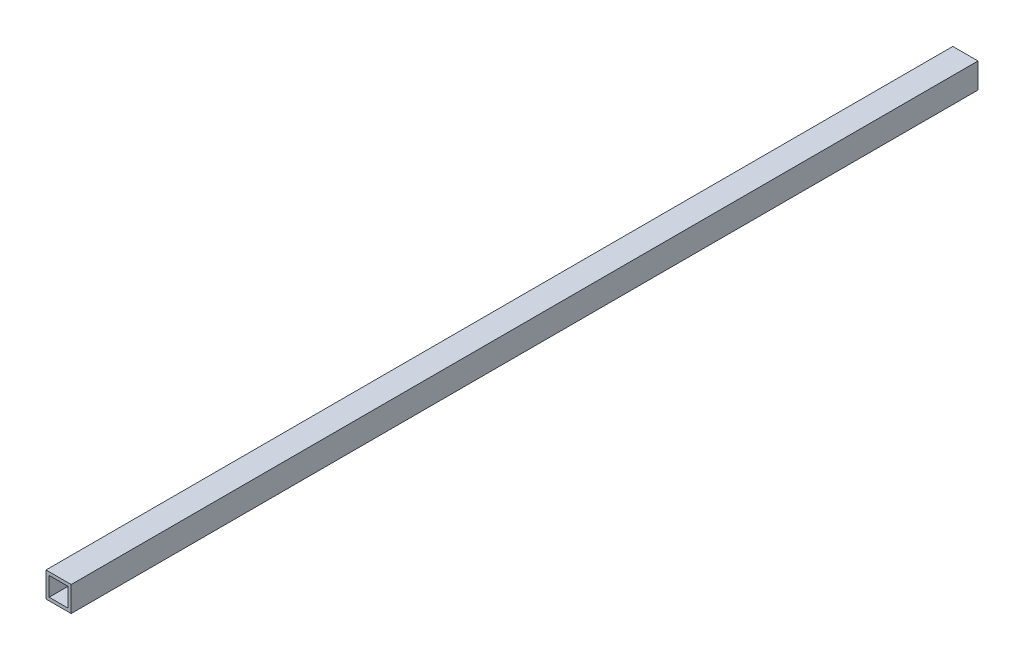
ISO-10303-21;
HEADER;
FILE_DESCRIPTION(('STEP AP214'),'2;1');
FILE_NAME('part.step','',(''),(''),'','','');
FILE_SCHEMA(('AUTOMOTIVE_DESIGN { 1 0 10303 214 1 1 1 1 }'));
ENDSEC;
DATA;
#1=APPLICATION_CONTEXT('core data for automotive mechanical design processes');
#2=APPLICATION_PROTOCOL_DEFINITION('international standard','automotive_design',2000,#1);
#3=PRODUCT_CONTEXT('',#1,'mechanical');
#4=PRODUCT('Part','Part','',(#3));
#5=PRODUCT_RELATED_PRODUCT_CATEGORY('part','',(#4));
#6=PRODUCT_DEFINITION_FORMATION('','',#4);
#7=PRODUCT_DEFINITION_CONTEXT('part definition',#1,'design');
#8=PRODUCT_DEFINITION('design','',#6,#7);
#9=PRODUCT_DEFINITION_SHAPE('','',#8);
#10=(LENGTH_UNIT() NAMED_UNIT(*) SI_UNIT(.MILLI.,.METRE.));
#11=(NAMED_UNIT(*) PLANE_ANGLE_UNIT() SI_UNIT($,.RADIAN.));
#12=(NAMED_UNIT(*) SI_UNIT($,.STERADIAN.) SOLID_ANGLE_UNIT());
#13=UNCERTAINTY_MEASURE_WITH_UNIT(LENGTH_MEASURE(1.E-05),#10,'distance_accuracy_value','');
#14=(GEOMETRIC_REPRESENTATION_CONTEXT(3) GLOBAL_UNCERTAINTY_ASSIGNED_CONTEXT((#13)) GLOBAL_UNIT_ASSIGNED_CONTEXT((#10,
#11,#12)) REPRESENTATION_CONTEXT('',''));
#15=CARTESIAN_POINT('',(0.,0.,0.));
#16=DIRECTION('',(0.,0.,1.));
#17=DIRECTION('',(1.,0.,0.));
#18=AXIS2_PLACEMENT_3D('',#15,#16,#17);
#19=CARTESIAN_POINT('',(0.,0.,457.2));
#20=DIRECTION('',(0.,0.,1.));
#21=DIRECTION('',(1.,0.,0.));
#22=AXIS2_PLACEMENT_3D('',#19,#20,#21);
#23=PLANE('',#22);
#24=DIRECTION('',(0.,-1.,0.));
#25=VECTOR('',#24,1.);
#26=CARTESIAN_POINT('',(-12.7,-12.7,457.2));
#27=LINE('',#26,#25);
#28=CARTESIAN_POINT('',(-12.7,12.7,457.2));
#29=VERTEX_POINT('',#28);
#30=CARTESIAN_POINT('',(-12.7,-12.7,457.2));
#31=VERTEX_POINT('',#30);
#32=EDGE_CURVE('E117',#29,#31,#27,.T.);
#33=ORIENTED_EDGE('',*,*,#32,.T.);
#34=DIRECTION('',(1.,0.,0.));
#35=VECTOR('',#34,1.);
#36=CARTESIAN_POINT('',(12.7,-12.7,457.2));
#37=LINE('',#36,#35);
#38=CARTESIAN_POINT('',(12.7,-12.7,457.2));
#39=VERTEX_POINT('',#38);
#40=EDGE_CURVE('E176',#31,#39,#37,.T.);
#41=ORIENTED_EDGE('',*,*,#40,.T.);
#42=DIRECTION('',(0.,1.,0.));
#43=VECTOR('',#42,1.);
#44=CARTESIAN_POINT('',(12.7,-12.7,457.2));
#45=LINE('',#44,#43);
#46=CARTESIAN_POINT('',(12.7,12.7,457.2));
#47=VERTEX_POINT('',#46);
#48=EDGE_CURVE('E179',#39,#47,#45,.T.);
#49=ORIENTED_EDGE('',*,*,#48,.T.);
#50=DIRECTION('',(-1.,0.,0.));
#51=VECTOR('',#50,1.);
#52=CARTESIAN_POINT('',(12.7,12.7,457.2));
#53=LINE('',#52,#51);
#54=EDGE_CURVE('E63',#47,#29,#53,.T.);
#55=ORIENTED_EDGE('',*,*,#54,.T.);
#56=EDGE_LOOP('',(#33,#41,#49,#55));
#57=FACE_BOUND('',#56,.T.);
#58=DIRECTION('',(1.,0.,0.));
#59=VECTOR('',#58,1.);
#60=CARTESIAN_POINT('',(9.525,-9.525,457.2));
#61=LINE('',#60,#59);
#62=CARTESIAN_POINT('',(-9.52499999999999,-9.525,457.2));
#63=VERTEX_POINT('',#62);
#64=CARTESIAN_POINT('',(9.525,-9.525,457.2));
#65=VERTEX_POINT('',#64);
#66=EDGE_CURVE('E158',#63,#65,#61,.T.);
#67=ORIENTED_EDGE('',*,*,#66,.F.);
#68=DIRECTION('',(0.,-1.,0.));
#69=VECTOR('',#68,1.);
#70=CARTESIAN_POINT('',(-9.52499999999999,-9.525,457.2));
#71=LINE('',#70,#69);
#72=CARTESIAN_POINT('',(-9.52499999999999,9.525,457.2));
#73=VERTEX_POINT('',#72);
#74=EDGE_CURVE('E113',#73,#63,#71,.T.);
#75=ORIENTED_EDGE('',*,*,#74,.F.);
#76=DIRECTION('',(-1.,0.,0.));
#77=VECTOR('',#76,1.);
#78=CARTESIAN_POINT('',(9.525,9.525,457.2));
#79=LINE('',#78,#77);
#80=CARTESIAN_POINT('',(9.525,9.525,457.2));
#81=VERTEX_POINT('',#80);
#82=EDGE_CURVE('E164',#81,#73,#79,.T.);
#83=ORIENTED_EDGE('',*,*,#82,.F.);
#84=DIRECTION('',(0.,1.,0.));
#85=VECTOR('',#84,1.);
#86=CARTESIAN_POINT('',(9.525,-9.525,457.2));
#87=LINE('',#86,#85);
#88=EDGE_CURVE('E161',#65,#81,#87,.T.);
#89=ORIENTED_EDGE('',*,*,#88,.F.);
#90=EDGE_LOOP('',(#67,#75,#83,#89));
#91=FACE_BOUND('',#90,.T.);
#92=ADVANCED_FACE('F39',(#57,#91),#23,.T.);
#93=CARTESIAN_POINT('',(-12.7,-12.7,457.2));
#94=DIRECTION('',(1.,0.,0.));
#95=DIRECTION('',(0.,0.,-1.));
#96=AXIS2_PLACEMENT_3D('',#93,#94,#95);
#97=PLANE('',#96);
#98=DIRECTION('',(0.,0.,-1.));
#99=VECTOR('',#98,1.);
#100=CARTESIAN_POINT('',(-12.7,12.7,457.2));
#101=LINE('',#100,#99);
#102=CARTESIAN_POINT('',(-12.7,12.7,-457.2));
#103=VERTEX_POINT('',#102);
#104=EDGE_CURVE('E184',#29,#103,#101,.T.);
#105=ORIENTED_EDGE('',*,*,#104,.T.);
#106=DIRECTION('',(0.,-1.,0.));
#107=VECTOR('',#106,1.);
#108=CARTESIAN_POINT('',(-12.7,-12.7,-457.2));
#109=LINE('',#108,#107);
#110=CARTESIAN_POINT('',(-12.7,-12.7,-457.2));
#111=VERTEX_POINT('',#110);
#112=EDGE_CURVE('E140',#103,#111,#109,.T.);
#113=ORIENTED_EDGE('',*,*,#112,.T.);
#114=DIRECTION('',(0.,0.,-1.));
#115=VECTOR('',#114,1.);
#116=CARTESIAN_POINT('',(-12.7,-12.7,457.2));
#117=LINE('',#116,#115);
#118=EDGE_CURVE('E11',#31,#111,#117,.T.);
#119=ORIENTED_EDGE('',*,*,#118,.F.);
#120=ORIENTED_EDGE('',*,*,#32,.F.);
#121=EDGE_LOOP('',(#105,#113,#119,#120));
#122=FACE_BOUND('',#121,.T.);
#123=ADVANCED_FACE('F41',(#122),#97,.F.);
#124=CARTESIAN_POINT('',(12.7,-12.7,457.2));
#125=DIRECTION('',(0.,1.,0.));
#126=DIRECTION('',(0.,0.,1.));
#127=AXIS2_PLACEMENT_3D('',#124,#125,#126);
#128=PLANE('',#127);
#129=ORIENTED_EDGE('',*,*,#118,.T.);
#130=DIRECTION('',(1.,0.,0.));
#131=VECTOR('',#130,1.);
#132=CARTESIAN_POINT('',(12.7,-12.7,-457.2));
#133=LINE('',#132,#131);
#134=CARTESIAN_POINT('',(12.7,-12.7,-457.2));
#135=VERTEX_POINT('',#134);
#136=EDGE_CURVE('E144',#111,#135,#133,.T.);
#137=ORIENTED_EDGE('',*,*,#136,.T.);
#138=DIRECTION('',(0.,0.,-1.));
#139=VECTOR('',#138,1.);
#140=CARTESIAN_POINT('',(12.7,-12.7,457.2));
#141=LINE('',#140,#139);
#142=EDGE_CURVE('E48',#39,#135,#141,.T.);
#143=ORIENTED_EDGE('',*,*,#142,.F.);
#144=ORIENTED_EDGE('',*,*,#40,.F.);
#145=EDGE_LOOP('',(#129,#137,#143,#144));
#146=FACE_BOUND('',#145,.T.);
#147=ADVANCED_FACE('F200',(#146),#128,.F.);
#148=CARTESIAN_POINT('',(12.7,-12.7,457.2));
#149=DIRECTION('',(-1.,0.,0.));
#150=DIRECTION('',(0.,0.,1.));
#151=AXIS2_PLACEMENT_3D('',#148,#149,#150);
#152=PLANE('',#151);
#153=ORIENTED_EDGE('',*,*,#142,.T.);
#154=DIRECTION('',(0.,1.,0.));
#155=VECTOR('',#154,1.);
#156=CARTESIAN_POINT('',(12.7,-12.7,-457.2));
#157=LINE('',#156,#155);
#158=CARTESIAN_POINT('',(12.7,12.7,-457.2));
#159=VERTEX_POINT('',#158);
#160=EDGE_CURVE('E148',#135,#159,#157,.T.);
#161=ORIENTED_EDGE('',*,*,#160,.T.);
#162=DIRECTION('',(0.,0.,-1.));
#163=VECTOR('',#162,1.);
#164=CARTESIAN_POINT('',(12.7,12.7,457.2));
#165=LINE('',#164,#163);
#166=EDGE_CURVE('E187',#47,#159,#165,.T.);
#167=ORIENTED_EDGE('',*,*,#166,.F.);
#168=ORIENTED_EDGE('',*,*,#48,.F.);
#169=EDGE_LOOP('',(#153,#161,#167,#168));
#170=FACE_BOUND('',#169,.T.);
#171=ADVANCED_FACE('F194',(#170),#152,.F.);
#172=CARTESIAN_POINT('',(12.7,12.7,457.2));
#173=DIRECTION('',(0.,-1.,0.));
#174=DIRECTION('',(0.,0.,-1.));
#175=AXIS2_PLACEMENT_3D('',#172,#173,#174);
#176=PLANE('',#175);
#177=ORIENTED_EDGE('',*,*,#166,.T.);
#178=DIRECTION('',(-1.,0.,0.));
#179=VECTOR('',#178,1.);
#180=CARTESIAN_POINT('',(12.7,12.7,-457.2));
#181=LINE('',#180,#179);
#182=EDGE_CURVE('E152',#159,#103,#181,.T.);
#183=ORIENTED_EDGE('',*,*,#182,.T.);
#184=ORIENTED_EDGE('',*,*,#104,.F.);
#185=ORIENTED_EDGE('',*,*,#54,.F.);
#186=EDGE_LOOP('',(#177,#183,#184,#185));
#187=FACE_BOUND('',#186,.T.);
#188=ADVANCED_FACE('F205',(#187),#176,.F.);
#189=CARTESIAN_POINT('',(-9.52499999999999,-9.525,457.2));
#190=DIRECTION('',(1.,0.,0.));
#191=DIRECTION('',(0.,0.,-1.));
#192=AXIS2_PLACEMENT_3D('',#189,#190,#191);
#193=PLANE('',#192);
#194=DIRECTION('',(0.,0.,-1.));
#195=VECTOR('',#194,1.);
#196=CARTESIAN_POINT('',(-9.52499999999999,-9.525,457.2));
#197=LINE('',#196,#195);
#198=CARTESIAN_POINT('',(-9.52499999999999,-9.525,-457.2));
#199=VERTEX_POINT('',#198);
#200=EDGE_CURVE('E105',#63,#199,#197,.T.);
#201=ORIENTED_EDGE('',*,*,#200,.T.);
#202=DIRECTION('',(0.,-1.,0.));
#203=VECTOR('',#202,1.);
#204=CARTESIAN_POINT('',(-9.52499999999999,-9.525,-457.2));
#205=LINE('',#204,#203);
#206=CARTESIAN_POINT('',(-9.52499999999999,9.525,-457.2));
#207=VERTEX_POINT('',#206);
#208=EDGE_CURVE('E110',#207,#199,#205,.T.);
#209=ORIENTED_EDGE('',*,*,#208,.F.);
#210=DIRECTION('',(0.,0.,-1.));
#211=VECTOR('',#210,1.);
#212=CARTESIAN_POINT('',(-9.52499999999999,9.525,457.2));
#213=LINE('',#212,#211);
#214=EDGE_CURVE('E167',#73,#207,#213,.T.);
#215=ORIENTED_EDGE('',*,*,#214,.F.);
#216=ORIENTED_EDGE('',*,*,#74,.T.);
#217=EDGE_LOOP('',(#201,#209,#215,#216));
#218=FACE_BOUND('',#217,.T.);
#219=ADVANCED_FACE('F107',(#218),#193,.T.);
#220=CARTESIAN_POINT('',(9.525,-9.525,457.2));
#221=DIRECTION('',(0.,1.,0.));
#222=DIRECTION('',(0.,0.,1.));
#223=AXIS2_PLACEMENT_3D('',#220,#221,#222);
#224=PLANE('',#223);
#225=DIRECTION('',(0.,0.,-1.));
#226=VECTOR('',#225,1.);
#227=CARTESIAN_POINT('',(9.525,-9.525,457.2));
#228=LINE('',#227,#226);
#229=CARTESIAN_POINT('',(9.525,-9.525,-457.2));
#230=VERTEX_POINT('',#229);
#231=EDGE_CURVE('E118',#65,#230,#228,.T.);
#232=ORIENTED_EDGE('',*,*,#231,.T.);
#233=DIRECTION('',(1.,0.,0.));
#234=VECTOR('',#233,1.);
#235=CARTESIAN_POINT('',(9.525,-9.525,-457.2));
#236=LINE('',#235,#234);
#237=EDGE_CURVE('E121',#199,#230,#236,.T.);
#238=ORIENTED_EDGE('',*,*,#237,.F.);
#239=ORIENTED_EDGE('',*,*,#200,.F.);
#240=ORIENTED_EDGE('',*,*,#66,.T.);
#241=EDGE_LOOP('',(#232,#238,#239,#240));
#242=FACE_BOUND('',#241,.T.);
#243=ADVANCED_FACE('F122',(#242),#224,.T.);
#244=CARTESIAN_POINT('',(9.525,-9.525,457.2));
#245=DIRECTION('',(-1.,0.,0.));
#246=DIRECTION('',(0.,0.,1.));
#247=AXIS2_PLACEMENT_3D('',#244,#245,#246);
#248=PLANE('',#247);
#249=DIRECTION('',(0.,0.,-1.));
#250=VECTOR('',#249,1.);
#251=CARTESIAN_POINT('',(9.525,9.525,457.2));
#252=LINE('',#251,#250);
#253=CARTESIAN_POINT('',(9.525,9.525,-457.2));
#254=VERTEX_POINT('',#253);
#255=EDGE_CURVE('E55',#81,#254,#252,.T.);
#256=ORIENTED_EDGE('',*,*,#255,.T.);
#257=DIRECTION('',(0.,1.,0.));
#258=VECTOR('',#257,1.);
#259=CARTESIAN_POINT('',(9.525,-9.525,-457.2));
#260=LINE('',#259,#258);
#261=EDGE_CURVE('E128',#230,#254,#260,.T.);
#262=ORIENTED_EDGE('',*,*,#261,.F.);
#263=ORIENTED_EDGE('',*,*,#231,.F.);
#264=ORIENTED_EDGE('',*,*,#88,.T.);
#265=EDGE_LOOP('',(#256,#262,#263,#264));
#266=FACE_BOUND('',#265,.T.);
#267=ADVANCED_FACE('F223',(#266),#248,.T.);
#268=CARTESIAN_POINT('',(9.525,9.525,457.2));
#269=DIRECTION('',(0.,-1.,0.));
#270=DIRECTION('',(0.,0.,-1.));
#271=AXIS2_PLACEMENT_3D('',#268,#269,#270);
#272=PLANE('',#271);
#273=ORIENTED_EDGE('',*,*,#214,.T.);
#274=DIRECTION('',(-1.,0.,0.));
#275=VECTOR('',#274,1.);
#276=CARTESIAN_POINT('',(9.525,9.525,-457.2));
#277=LINE('',#276,#275);
#278=EDGE_CURVE('E132',#254,#207,#277,.T.);
#279=ORIENTED_EDGE('',*,*,#278,.F.);
#280=ORIENTED_EDGE('',*,*,#255,.F.);
#281=ORIENTED_EDGE('',*,*,#82,.T.);
#282=EDGE_LOOP('',(#273,#279,#280,#281));
#283=FACE_BOUND('',#282,.T.);
#284=ADVANCED_FACE('F226',(#283),#272,.T.);
#285=CARTESIAN_POINT('',(0.,0.,-457.2));
#286=DIRECTION('',(0.,0.,1.));
#287=DIRECTION('',(1.,0.,0.));
#288=AXIS2_PLACEMENT_3D('',#285,#286,#287);
#289=PLANE('',#288);
#290=ORIENTED_EDGE('',*,*,#278,.T.);
#291=ORIENTED_EDGE('',*,*,#208,.T.);
#292=ORIENTED_EDGE('',*,*,#237,.T.);
#293=ORIENTED_EDGE('',*,*,#261,.T.);
#294=EDGE_LOOP('',(#290,#291,#292,#293));
#295=FACE_BOUND('',#294,.T.);
#296=ORIENTED_EDGE('',*,*,#112,.F.);
#297=ORIENTED_EDGE('',*,*,#182,.F.);
#298=ORIENTED_EDGE('',*,*,#160,.F.);
#299=ORIENTED_EDGE('',*,*,#136,.F.);
#300=EDGE_LOOP('',(#296,#297,#298,#299));
#301=FACE_BOUND('',#300,.T.);
#302=ADVANCED_FACE('F130',(#295,#301),#289,.F.);
#303=CLOSED_SHELL('',(#92,#123,#147,#171,#188,#219,#243,#267,#284,#302));
#304=MANIFOLD_SOLID_BREP('B2',#303);
#305=ADVANCED_BREP_SHAPE_REPRESENTATION('',(#18,#304),#14);
#306=SHAPE_DEFINITION_REPRESENTATION(#9,#305);
ENDSEC;
END-ISO-10303-21;
